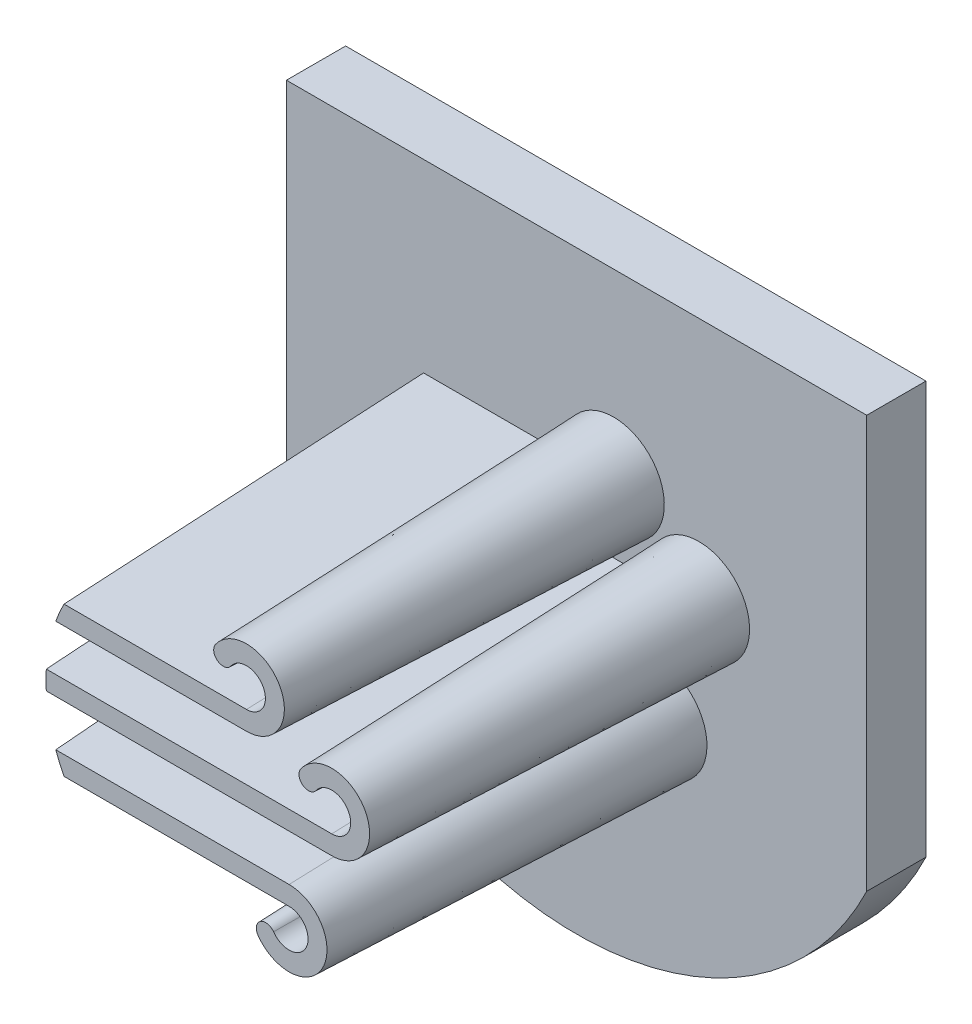
ISO-10303-21;
HEADER;
FILE_DESCRIPTION(('STEP AP214'),'2;1');
FILE_NAME('part.step','',(''),(''),'','','');
FILE_SCHEMA(('AUTOMOTIVE_DESIGN { 1 0 10303 214 1 1 1 1 }'));
ENDSEC;
DATA;
#1=APPLICATION_CONTEXT('core data for automotive mechanical design processes');
#2=APPLICATION_PROTOCOL_DEFINITION('international standard','automotive_design',2000,#1);
#3=PRODUCT_CONTEXT('',#1,'mechanical');
#4=PRODUCT('Part','Part','',(#3));
#5=PRODUCT_RELATED_PRODUCT_CATEGORY('part','',(#4));
#6=PRODUCT_DEFINITION_FORMATION('','',#4);
#7=PRODUCT_DEFINITION_CONTEXT('part definition',#1,'design');
#8=PRODUCT_DEFINITION('design','',#6,#7);
#9=PRODUCT_DEFINITION_SHAPE('','',#8);
#10=(LENGTH_UNIT() NAMED_UNIT(*) SI_UNIT(.MILLI.,.METRE.));
#11=(NAMED_UNIT(*) PLANE_ANGLE_UNIT() SI_UNIT($,.RADIAN.));
#12=(NAMED_UNIT(*) SI_UNIT($,.STERADIAN.) SOLID_ANGLE_UNIT());
#13=UNCERTAINTY_MEASURE_WITH_UNIT(LENGTH_MEASURE(1.E-05),#10,'distance_accuracy_value','');
#14=(GEOMETRIC_REPRESENTATION_CONTEXT(3) GLOBAL_UNCERTAINTY_ASSIGNED_CONTEXT((#13)) GLOBAL_UNIT_ASSIGNED_CONTEXT((#10,
#11,#12)) REPRESENTATION_CONTEXT('',''));
#15=CARTESIAN_POINT('',(0.,0.,0.));
#16=DIRECTION('',(0.,0.,1.));
#17=DIRECTION('',(1.,0.,0.));
#18=AXIS2_PLACEMENT_3D('',#15,#16,#17);
#19=CARTESIAN_POINT('',(1.68118189982806,-1.975,7.74999999998727));
#20=DIRECTION('',(0.,0.,1.));
#21=DIRECTION('',(1.,0.,0.));
#22=AXIS2_PLACEMENT_3D('',#19,#20,#21);
#23=CONICAL_SURFACE('',#22,0.400030477214558,0.0349065850394999);
#24=CARTESIAN_POINT('',(1.68118189982806,-1.975,7.74999999998727));
#25=DIRECTION('',(0.,0.,1.));
#26=DIRECTION('',(1.,0.,0.));
#27=AXIS2_PLACEMENT_3D('',#24,#25,#26);
#28=CIRCLE('',#27,0.400030477214558);
#29=CARTESIAN_POINT('',(1.68118189982806,-1.57496952278529,7.74999999999363));
#30=VERTEX_POINT('',#29);
#31=CARTESIAN_POINT('',(1.35349611664045,-2.20444805555241,7.74999999998727));
#32=VERTEX_POINT('',#31);
#33=EDGE_CURVE('E172',#30,#32,#28,.F.);
#34=ORIENTED_EDGE('',*,*,#33,.F.);
#35=DIRECTION('',(0.,-0.0348994967025009,-0.999390827019096));
#36=VECTOR('',#35,1.);
#37=CARTESIAN_POINT('',(1.68118189982806,-1.57503045864905,7.74825502516488));
#38=LINE('',#37,#36);
#39=CARTESIAN_POINT('',(1.68118189982806,-1.84560548634611,0.));
#40=VERTEX_POINT('',#39);
#41=EDGE_CURVE('E160',#40,#30,#38,.F.);
#42=ORIENTED_EDGE('',*,*,#41,.F.);
#43=CARTESIAN_POINT('',(1.68118189982806,-1.975,0.));
#44=DIRECTION('',(0.,0.,1.));
#45=DIRECTION('',(1.,0.,0.));
#46=AXIS2_PLACEMENT_3D('',#43,#44,#45);
#47=CIRCLE('',#46,0.129394513656959);
#48=CARTESIAN_POINT('',(1.57518811944871,-2.04921764402519,0.));
#49=VERTEX_POINT('',#48);
#50=EDGE_CURVE('E20',#49,#40,#47,.T.);
#51=ORIENTED_EDGE('',*,*,#50,.F.);
#52=DIRECTION('',(-0.0285879940685106,-0.0200175289490657,0.999390827019096));
#53=VECTOR('',#52,1.);
#54=CARTESIAN_POINT('',(14275.679627057,9992.78631169279,-499000.));
#55=LINE('',#54,#53);
#56=EDGE_CURVE('E157',#32,#49,#55,.F.);
#57=ORIENTED_EDGE('',*,*,#56,.F.);
#58=EDGE_LOOP('',(#34,#42,#51,#57));
#59=FACE_BOUND('',#58,.T.);
#60=ADVANCED_FACE('F17',(#59),#23,.F.);
#61=CARTESIAN_POINT('',(1.18969067325467,-2.31914586181063,1.70530256582424E-10));
#62=DIRECTION('',(0.,0.,-1.));
#63=DIRECTION('',(-1.,0.,0.));
#64=AXIS2_PLACEMENT_3D('',#61,#62,#63);
#65=CONICAL_SURFACE('',#64,0.470605486341061,0.0349065850402135);
#66=CARTESIAN_POINT('',(1.18969067325467,-2.31914586181063,0.));
#67=DIRECTION('',(0.,0.,-1.));
#68=DIRECTION('',(-1.,0.,0.));
#69=AXIS2_PLACEMENT_3D('',#66,#67,#68);
#70=CIRCLE('',#69,0.470605486347016);
#71=CARTESIAN_POINT('',(0.804193227060108,-2.58907407959762,0.));
#72=VERTEX_POINT('',#71);
#73=EDGE_CURVE('E165',#49,#72,#70,.F.);
#74=ORIENTED_EDGE('',*,*,#73,.T.);
#75=DIRECTION('',(0.0285879940685106,0.0200175289490656,0.999390827019096));
#76=VECTOR('',#75,1.);
#77=CARTESIAN_POINT('',(-14273.3002457105,-9997.42460341637,-499000.));
#78=LINE('',#77,#76);
#79=CARTESIAN_POINT('',(1.02588522987041,-2.43384366806921,7.74999999998727));
#80=VERTEX_POINT('',#79);
#81=EDGE_CURVE('E214',#80,#72,#78,.F.);
#82=ORIENTED_EDGE('',*,*,#81,.F.);
#83=CARTESIAN_POINT('',(1.18969067325467,-2.31914586181063,7.74999999998727));
#84=DIRECTION('',(0.,0.,-1.));
#85=DIRECTION('',(-1.,0.,0.));
#86=AXIS2_PLACEMENT_3D('',#83,#84,#85);
#87=CIRCLE('',#86,0.199969522783879);
#88=EDGE_CURVE('E174',#32,#80,#87,.F.);
#89=ORIENTED_EDGE('',*,*,#88,.F.);
#90=ORIENTED_EDGE('',*,*,#56,.T.);
#91=EDGE_LOOP('',(#74,#82,#89,#90));
#92=FACE_BOUND('',#91,.T.);
#93=ADVANCED_FACE('F173',(#92),#65,.T.);
#94=CARTESIAN_POINT('',(0.,-0.525,7.75));
#95=DIRECTION('',(0.,0.,1.));
#96=DIRECTION('',(1.,0.,0.));
#97=AXIS2_PLACEMENT_3D('',#94,#95,#96);
#98=PLANE('',#97);
#99=ORIENTED_EDGE('',*,*,#33,.T.);
#100=ORIENTED_EDGE('',*,*,#88,.T.);
#101=CARTESIAN_POINT('',(1.68118189982806,-1.975,7.74999999998727));
#102=DIRECTION('',(0.,0.,-1.));
#103=DIRECTION('',(-1.,0.,0.));
#104=AXIS2_PLACEMENT_3D('',#101,#102,#103);
#105=CIRCLE('',#104,0.799969522784775);
#106=CARTESIAN_POINT('',(1.68118189982806,-1.17503047721471,7.74999999999363));
#107=VERTEX_POINT('',#106);
#108=EDGE_CURVE('E211',#107,#80,#105,.T.);
#109=ORIENTED_EDGE('',*,*,#108,.F.);
#110=DIRECTION('',(1.,0.,0.));
#111=VECTOR('',#110,1.);
#112=CARTESIAN_POINT('',(0.,-1.17503047721494,7.75));
#113=LINE('',#112,#111);
#114=CARTESIAN_POINT('',(-3.243700523438,-1.17503047721494,7.74999999999363));
#115=VERTEX_POINT('',#114);
#116=EDGE_CURVE('E371',#115,#107,#113,.T.);
#117=ORIENTED_EDGE('',*,*,#116,.F.);
#118=CARTESIAN_POINT('',(0.,0.,7.74999999998727));
#119=DIRECTION('',(0.,0.,-1.));
#120=DIRECTION('',(-1.,0.,0.));
#121=AXIS2_PLACEMENT_3D('',#118,#119,#120);
#122=CIRCLE('',#121,3.44996952278214);
#123=CARTESIAN_POINT('',(-3.06948867247192,-1.57496952278529,7.74999999999363));
#124=VERTEX_POINT('',#123);
#125=EDGE_CURVE('E249',#124,#115,#122,.T.);
#126=ORIENTED_EDGE('',*,*,#125,.F.);
#127=DIRECTION('',(1.,0.,0.));
#128=VECTOR('',#127,1.);
#129=CARTESIAN_POINT('',(0.,-1.57496952278506,7.75));
#130=LINE('',#129,#128);
#131=EDGE_CURVE('E257',#30,#124,#130,.F.);
#132=ORIENTED_EDGE('',*,*,#131,.F.);
#133=EDGE_LOOP('',(#99,#100,#109,#117,#126,#132));
#134=FACE_BOUND('',#133,.T.);
#135=ADVANCED_FACE('F255',(#134),#98,.T.);
#136=CARTESIAN_POINT('',(0.,0.,5.6843418860808E-11));
#137=DIRECTION('',(0.,0.,-1.));
#138=DIRECTION('',(-1.,0.,0.));
#139=AXIS2_PLACEMENT_3D('',#136,#137,#138);
#140=CONICAL_SURFACE('',#139,3.72060548634329,0.0349065850402135);
#141=CARTESIAN_POINT('',(0.,0.,0.));
#142=DIRECTION('',(0.,0.,-1.));
#143=DIRECTION('',(-1.,0.,0.));
#144=AXIS2_PLACEMENT_3D('',#141,#142,#143);
#145=CIRCLE('',#144,3.72060548634528);
#146=CARTESIAN_POINT('',(-3.60901312670119,-0.904394513653894,0.));
#147=VERTEX_POINT('',#146);
#148=CARTESIAN_POINT('',(-3.23057975815411,-1.84560548634611,0.));
#149=VERTEX_POINT('',#148);
#150=EDGE_CURVE('E247',#147,#149,#145,.F.);
#151=ORIENTED_EDGE('',*,*,#150,.T.);
#152=CARTESIAN_POINT('',(-3.06948867247364,-1.57496952278506,7.75));
#153=CARTESIAN_POINT('',(-3.1500342153141,-1.70682745951414,3.97408272646348));
#154=CARTESIAN_POINT('',(-3.23057975815455,-1.84560548634611,0.));
#155=B_SPLINE_CURVE_WITH_KNOTS('',2,(#152,#153,#154),.UNSPECIFIED.,.F.,.F.,(3,3),(0.,1.),.UNSPECIFIED.);
#156=EDGE_CURVE('E215',#124,#149,#155,.T.);
#157=ORIENTED_EDGE('',*,*,#156,.F.);
#158=ORIENTED_EDGE('',*,*,#125,.T.);
#159=CARTESIAN_POINT('',(-3.60901312670198,-0.904394513653891,0.));
#160=CARTESIAN_POINT('',(-3.42635682506583,-1.04692618722687,4.08157310527367));
#161=CARTESIAN_POINT('',(-3.24370052343952,-1.17503047721494,7.75));
#162=B_SPLINE_CURVE_WITH_KNOTS('',2,(#159,#160,#161),.UNSPECIFIED.,.F.,.F.,(3,3),(0.,1.),.UNSPECIFIED.);
#163=EDGE_CURVE('E366',#147,#115,#162,.T.);
#164=ORIENTED_EDGE('',*,*,#163,.F.);
#165=EDGE_LOOP('',(#151,#157,#158,#164));
#166=FACE_BOUND('',#165,.T.);
#167=ADVANCED_FACE('F415',(#166),#140,.T.);
#168=CARTESIAN_POINT('',(2.08969067325467,0.944145861810627,1.70530256582424E-10));
#169=DIRECTION('',(0.,0.,-1.));
#170=DIRECTION('',(-1.,0.,0.));
#171=AXIS2_PLACEMENT_3D('',#168,#169,#170);
#172=CONICAL_SURFACE('',#171,0.470605486338964,0.0349065850397557);
#173=CARTESIAN_POINT('',(2.08969067325467,0.944145861810627,0.));
#174=DIRECTION('',(0.,0.,-1.));
#175=DIRECTION('',(-1.,0.,0.));
#176=AXIS2_PLACEMENT_3D('',#173,#174,#175);
#177=CIRCLE('',#176,0.470605486344919);
#178=CARTESIAN_POINT('',(1.70419322706021,1.21407407959724,0.));
#179=VERTEX_POINT('',#178);
#180=CARTESIAN_POINT('',(2.47518811944563,0.674217644027312,0.));
#181=VERTEX_POINT('',#180);
#182=EDGE_CURVE('E244',#179,#181,#177,.F.);
#183=ORIENTED_EDGE('',*,*,#182,.T.);
#184=DIRECTION('',(0.0285879940685106,-0.0200175289490656,-0.999390827019096));
#185=VECTOR('',#184,1.);
#186=CARTESIAN_POINT('',(-14271.6292508181,9995.50974698082,499000.));
#187=LINE('',#186,#185);
#188=CARTESIAN_POINT('',(2.25349611663888,0.829448055554044,7.74999999998727));
#189=VERTEX_POINT('',#188);
#190=EDGE_CURVE('E179',#181,#189,#187,.F.);
#191=ORIENTED_EDGE('',*,*,#190,.T.);
#192=CARTESIAN_POINT('',(2.08969067325467,0.944145861810627,7.74999999998727));
#193=DIRECTION('',(0.,0.,-1.));
#194=DIRECTION('',(-1.,0.,0.));
#195=AXIS2_PLACEMENT_3D('',#192,#193,#194);
#196=CIRCLE('',#195,0.199969522785334);
#197=CARTESIAN_POINT('',(1.9258852298685,1.05884366806912,7.74999999998727));
#198=VERTEX_POINT('',#197);
#199=EDGE_CURVE('E241',#198,#189,#196,.F.);
#200=ORIENTED_EDGE('',*,*,#199,.F.);
#201=DIRECTION('',(0.0285879940685105,-0.0200175289490657,0.999390827019096));
#202=VECTOR('',#201,1.);
#203=CARTESIAN_POINT('',(-14272.4002457105,9996.04960341643,-499000.));
#204=LINE('',#203,#202);
#205=EDGE_CURVE('E337',#179,#198,#204,.T.);
#206=ORIENTED_EDGE('',*,*,#205,.F.);
#207=EDGE_LOOP('',(#183,#191,#200,#206));
#208=FACE_BOUND('',#207,.T.);
#209=ADVANCED_FACE('F411',(#208),#172,.T.);
#210=CARTESIAN_POINT('',(0.,-0.525,7.75));
#211=DIRECTION('',(0.,0.,1.));
#212=DIRECTION('',(1.,0.,0.));
#213=AXIS2_PLACEMENT_3D('',#210,#211,#212);
#214=PLANE('',#213);
#215=CARTESIAN_POINT('',(2.58118189982806,0.6,7.74999999998727));
#216=DIRECTION('',(0.,0.,-1.));
#217=DIRECTION('',(-1.,0.,0.));
#218=AXIS2_PLACEMENT_3D('',#215,#216,#217);
#219=CIRCLE('',#218,0.79996952278623);
#220=CARTESIAN_POINT('',(2.58118189982806,-0.199969522786761,7.75000000000466));
#221=VERTEX_POINT('',#220);
#222=EDGE_CURVE('E206',#198,#221,#219,.T.);
#223=ORIENTED_EDGE('',*,*,#222,.F.);
#224=ORIENTED_EDGE('',*,*,#199,.T.);
#225=CARTESIAN_POINT('',(2.58118189982806,0.6,7.74999999998727));
#226=DIRECTION('',(0.,0.,1.));
#227=DIRECTION('',(1.,0.,0.));
#228=AXIS2_PLACEMENT_3D('',#225,#226,#227);
#229=CIRCLE('',#228,0.400030477216014);
#230=CARTESIAN_POINT('',(2.58118189982806,0.199969522785281,7.74999999999363));
#231=VERTEX_POINT('',#230);
#232=EDGE_CURVE('E237',#189,#231,#229,.F.);
#233=ORIENTED_EDGE('',*,*,#232,.T.);
#234=DIRECTION('',(1.,0.,0.));
#235=VECTOR('',#234,1.);
#236=CARTESIAN_POINT('',(0.,0.199969522785059,7.75));
#237=LINE('',#236,#235);
#238=CARTESIAN_POINT('',(-3.44416926095464,0.199969522785282,7.74999999999363));
#239=VERTEX_POINT('',#238);
#240=EDGE_CURVE('E329',#239,#231,#237,.T.);
#241=ORIENTED_EDGE('',*,*,#240,.F.);
#242=CARTESIAN_POINT('',(0.,0.,7.74999999998727));
#243=DIRECTION('',(0.,0.,-1.));
#244=DIRECTION('',(-1.,0.,0.));
#245=AXIS2_PLACEMENT_3D('',#242,#243,#244);
#246=CIRCLE('',#245,3.44996952278564);
#247=CARTESIAN_POINT('',(-3.44416926095464,-0.199969522785281,7.74999999999363));
#248=VERTEX_POINT('',#247);
#249=EDGE_CURVE('E234',#248,#239,#246,.T.);
#250=ORIENTED_EDGE('',*,*,#249,.F.);
#251=DIRECTION('',(1.,0.,0.));
#252=VECTOR('',#251,1.);
#253=CARTESIAN_POINT('',(0.,-0.199969522785059,7.75));
#254=LINE('',#253,#252);
#255=EDGE_CURVE('E347',#221,#248,#254,.F.);
#256=ORIENTED_EDGE('',*,*,#255,.F.);
#257=EDGE_LOOP('',(#223,#224,#233,#241,#250,#256));
#258=FACE_BOUND('',#257,.T.);
#259=ADVANCED_FACE('F407',(#258),#214,.T.);
#260=CARTESIAN_POINT('',(2.58118189982806,0.6,7.74999999998727));
#261=DIRECTION('',(0.,0.,1.));
#262=DIRECTION('',(1.,0.,0.));
#263=AXIS2_PLACEMENT_3D('',#260,#261,#262);
#264=CONICAL_SURFACE('',#263,0.400030477216014,0.0349065850394999);
#265=ORIENTED_EDGE('',*,*,#232,.F.);
#266=ORIENTED_EDGE('',*,*,#190,.F.);
#267=CARTESIAN_POINT('',(2.58118189982806,0.6,0.));
#268=DIRECTION('',(0.,0.,1.));
#269=DIRECTION('',(1.,0.,0.));
#270=AXIS2_PLACEMENT_3D('',#267,#268,#269);
#271=CIRCLE('',#270,0.129394513658414);
#272=CARTESIAN_POINT('',(2.58118189982806,0.470605486346103,0.));
#273=VERTEX_POINT('',#272);
#274=EDGE_CURVE('E239',#273,#181,#271,.T.);
#275=ORIENTED_EDGE('',*,*,#274,.F.);
#276=DIRECTION('',(0.,-0.0348994967025009,0.999390827019096));
#277=VECTOR('',#276,1.);
#278=CARTESIAN_POINT('',(2.58118189982806,0.200030458649045,7.74825502516488));
#279=LINE('',#278,#277);
#280=EDGE_CURVE('E328',#231,#273,#279,.F.);
#281=ORIENTED_EDGE('',*,*,#280,.F.);
#282=EDGE_LOOP('',(#265,#266,#275,#281));
#283=FACE_BOUND('',#282,.T.);
#284=ADVANCED_FACE('F403',(#283),#264,.F.);
#285=CARTESIAN_POINT('',(0.,0.,5.6843418860808E-11));
#286=DIRECTION('',(0.,0.,-1.));
#287=DIRECTION('',(-1.,0.,0.));
#288=AXIS2_PLACEMENT_3D('',#285,#286,#287);
#289=CONICAL_SURFACE('',#288,3.7206054863468,0.0349065850402135);
#290=CARTESIAN_POINT('',(0.,0.,0.));
#291=DIRECTION('',(0.,0.,-1.));
#292=DIRECTION('',(-1.,0.,0.));
#293=AXIS2_PLACEMENT_3D('',#290,#291,#292);
#294=CIRCLE('',#293,3.72060548634878);
#295=CARTESIAN_POINT('',(-3.69072291851606,0.470605486346103,0.));
#296=VERTEX_POINT('',#295);
#297=CARTESIAN_POINT('',(-3.69072291851642,-0.470605486346589,0.));
#298=VERTEX_POINT('',#297);
#299=EDGE_CURVE('E232',#296,#298,#294,.F.);
#300=ORIENTED_EDGE('',*,*,#299,.T.);
#301=CARTESIAN_POINT('',(-3.44416926095436,-0.199969522785058,7.75));
#302=CARTESIAN_POINT('',(-3.56744608972748,-0.330611450246071,4.00890467585814));
#303=CARTESIAN_POINT('',(-3.69072291851555,-0.470605486346104,0.));
#304=B_SPLINE_CURVE_WITH_KNOTS('',2,(#301,#302,#303),.UNSPECIFIED.,.F.,.F.,(3,3),(0.,1.),.UNSPECIFIED.);
#305=EDGE_CURVE('E210',#248,#298,#304,.T.);
#306=ORIENTED_EDGE('',*,*,#305,.F.);
#307=ORIENTED_EDGE('',*,*,#249,.T.);
#308=CARTESIAN_POINT('',(-3.6907229185147,0.470605486346104,0.));
#309=CARTESIAN_POINT('',(-3.56744608973465,0.330611450253676,4.0089046756404));
#310=CARTESIAN_POINT('',(-3.44416926095435,0.199969522785059,7.75));
#311=B_SPLINE_CURVE_WITH_KNOTS('',2,(#308,#309,#310),.UNSPECIFIED.,.F.,.F.,(3,3),(0.,1.),.UNSPECIFIED.);
#312=EDGE_CURVE('E324',#296,#239,#311,.T.);
#313=ORIENTED_EDGE('',*,*,#312,.F.);
#314=EDGE_LOOP('',(#300,#306,#307,#313));
#315=FACE_BOUND('',#314,.T.);
#316=ADVANCED_FACE('F400',(#315),#289,.T.);
#317=CARTESIAN_POINT('',(0.289690673254666,2.31914586181063,1.70530256582424E-10));
#318=DIRECTION('',(0.,0.,-1.));
#319=DIRECTION('',(-1.,0.,0.));
#320=AXIS2_PLACEMENT_3D('',#317,#318,#319);
#321=CONICAL_SURFACE('',#320,0.470605486336057,0.0349065850402135);
#322=CARTESIAN_POINT('',(0.289690673254666,2.31914586181063,0.));
#323=DIRECTION('',(0.,0.,-1.));
#324=DIRECTION('',(-1.,0.,0.));
#325=AXIS2_PLACEMENT_3D('',#322,#323,#324);
#326=CIRCLE('',#325,0.470605486342012);
#327=CARTESIAN_POINT('',(-0.0958067729372949,2.58907407959514,0.));
#328=VERTEX_POINT('',#327);
#329=CARTESIAN_POINT('',(0.675188119444742,2.0492176440282,0.));
#330=VERTEX_POINT('',#329);
#331=EDGE_CURVE('E229',#328,#330,#326,.F.);
#332=ORIENTED_EDGE('',*,*,#331,.T.);
#333=DIRECTION('',(0.0285879940685104,-0.0200175289490659,-0.999390827019096));
#334=VECTOR('',#333,1.);
#335=CARTESIAN_POINT('',(-14273.429250818,9996.88474698098,499000.));
#336=LINE('',#335,#334);
#337=CARTESIAN_POINT('',(0.453496116636133,2.20444805555445,7.74999999998727));
#338=VERTEX_POINT('',#337);
#339=EDGE_CURVE('E223',#330,#338,#336,.F.);
#340=ORIENTED_EDGE('',*,*,#339,.T.);
#341=CARTESIAN_POINT('',(0.289690673254666,2.31914586181063,7.74999999998727));
#342=DIRECTION('',(0.,0.,-1.));
#343=DIRECTION('',(-1.,0.,0.));
#344=AXIS2_PLACEMENT_3D('',#341,#342,#343);
#345=CIRCLE('',#344,0.199969522778875);
#346=CARTESIAN_POINT('',(0.125885229872456,2.43384366806688,7.74999999998727));
#347=VERTEX_POINT('',#346);
#348=EDGE_CURVE('E226',#347,#338,#345,.F.);
#349=ORIENTED_EDGE('',*,*,#348,.F.);
#350=DIRECTION('',(0.0285879940685106,-0.0200175289490656,0.999390827019096));
#351=VECTOR('',#350,1.);
#352=CARTESIAN_POINT('',(-14274.2002457105,9997.42460341641,-499000.));
#353=LINE('',#352,#351);
#354=EDGE_CURVE('E289',#328,#347,#353,.T.);
#355=ORIENTED_EDGE('',*,*,#354,.F.);
#356=EDGE_LOOP('',(#332,#340,#349,#355));
#357=FACE_BOUND('',#356,.T.);
#358=ADVANCED_FACE('F267',(#357),#321,.T.);
#359=CARTESIAN_POINT('',(0.,-0.525,7.75));
#360=DIRECTION('',(0.,0.,1.));
#361=DIRECTION('',(1.,0.,0.));
#362=AXIS2_PLACEMENT_3D('',#359,#360,#361);
#363=PLANE('',#362);
#364=CARTESIAN_POINT('',(0.781181899828061,1.975,7.74999999998727));
#365=DIRECTION('',(0.,0.,-1.));
#366=DIRECTION('',(-1.,0.,0.));
#367=AXIS2_PLACEMENT_3D('',#364,#365,#366);
#368=CIRCLE('',#367,0.799969522783319);
#369=CARTESIAN_POINT('',(0.781181899828061,1.17503047721399,7.75000000000466));
#370=VERTEX_POINT('',#369);
#371=EDGE_CURVE('E201',#347,#370,#368,.T.);
#372=ORIENTED_EDGE('',*,*,#371,.F.);
#373=ORIENTED_EDGE('',*,*,#348,.T.);
#374=CARTESIAN_POINT('',(0.781181899828061,1.975,7.74999999998727));
#375=DIRECTION('',(0.,0.,1.));
#376=DIRECTION('',(1.,0.,0.));
#377=AXIS2_PLACEMENT_3D('',#374,#375,#376);
#378=CIRCLE('',#377,0.400030477216655);
#379=CARTESIAN_POINT('',(0.781181899828062,1.57496952278529,7.74999999999363));
#380=VERTEX_POINT('',#379);
#381=EDGE_CURVE('E221',#338,#380,#378,.F.);
#382=ORIENTED_EDGE('',*,*,#381,.T.);
#383=DIRECTION('',(1.,0.,0.));
#384=VECTOR('',#383,1.);
#385=CARTESIAN_POINT('',(0.,1.57496952278506,7.75));
#386=LINE('',#385,#384);
#387=CARTESIAN_POINT('',(-3.06948867247398,1.57496952278506,7.74999999999363));
#388=VERTEX_POINT('',#387);
#389=EDGE_CURVE('E284',#388,#380,#386,.T.);
#390=ORIENTED_EDGE('',*,*,#389,.F.);
#391=CARTESIAN_POINT('',(0.,0.,7.74999999998727));
#392=DIRECTION('',(0.,0.,-1.));
#393=DIRECTION('',(-1.,0.,0.));
#394=AXIS2_PLACEMENT_3D('',#391,#392,#393);
#395=CIRCLE('',#394,3.44996952278565);
#396=CARTESIAN_POINT('',(-3.24370052343993,1.17503047721471,7.74999999999363));
#397=VERTEX_POINT('',#396);
#398=EDGE_CURVE('E218',#397,#388,#395,.T.);
#399=ORIENTED_EDGE('',*,*,#398,.F.);
#400=DIRECTION('',(1.,0.,0.));
#401=VECTOR('',#400,1.);
#402=CARTESIAN_POINT('',(0.,1.17503047721494,7.75));
#403=LINE('',#402,#401);
#404=EDGE_CURVE('E303',#370,#397,#403,.F.);
#405=ORIENTED_EDGE('',*,*,#404,.F.);
#406=EDGE_LOOP('',(#372,#373,#382,#390,#399,#405));
#407=FACE_BOUND('',#406,.T.);
#408=ADVANCED_FACE('F273',(#407),#363,.T.);
#409=CARTESIAN_POINT('',(0.781181899828061,1.975,7.74999999998727));
#410=DIRECTION('',(0.,0.,1.));
#411=DIRECTION('',(1.,0.,0.));
#412=AXIS2_PLACEMENT_3D('',#409,#410,#411);
#413=CONICAL_SURFACE('',#412,0.400030477216655,0.0349065850394999);
#414=ORIENTED_EDGE('',*,*,#381,.F.);
#415=ORIENTED_EDGE('',*,*,#339,.F.);
#416=CARTESIAN_POINT('',(0.781181899828061,1.975,0.));
#417=DIRECTION('',(0.,0.,1.));
#418=DIRECTION('',(1.,0.,0.));
#419=AXIS2_PLACEMENT_3D('',#416,#417,#418);
#420=CIRCLE('',#419,0.129394513659055);
#421=CARTESIAN_POINT('',(0.781181899828062,1.84560548634611,0.));
#422=VERTEX_POINT('',#421);
#423=EDGE_CURVE('E224',#422,#330,#420,.T.);
#424=ORIENTED_EDGE('',*,*,#423,.F.);
#425=DIRECTION('',(0.,-0.0348994967025009,0.999390827019096));
#426=VECTOR('',#425,1.);
#427=CARTESIAN_POINT('',(0.781181899828062,1.57503045864905,7.74825502516488));
#428=LINE('',#427,#426);
#429=EDGE_CURVE('E278',#380,#422,#428,.F.);
#430=ORIENTED_EDGE('',*,*,#429,.F.);
#431=EDGE_LOOP('',(#414,#415,#424,#430));
#432=FACE_BOUND('',#431,.T.);
#433=ADVANCED_FACE('F276',(#432),#413,.F.);
#434=CARTESIAN_POINT('',(0.,0.,5.6843418860808E-11));
#435=DIRECTION('',(0.,0.,-1.));
#436=DIRECTION('',(-1.,0.,0.));
#437=AXIS2_PLACEMENT_3D('',#434,#435,#436);
#438=CONICAL_SURFACE('',#437,3.72060548634681,0.0349065850402135);
#439=CARTESIAN_POINT('',(0.,0.,0.));
#440=DIRECTION('',(0.,0.,-1.));
#441=DIRECTION('',(-1.,0.,0.));
#442=AXIS2_PLACEMENT_3D('',#439,#440,#441);
#443=CIRCLE('',#442,3.72060548634879);
#444=CARTESIAN_POINT('',(-3.23057975815611,1.84560548634611,0.));
#445=VERTEX_POINT('',#444);
#446=CARTESIAN_POINT('',(-3.60901312670306,0.904394513653584,0.));
#447=VERTEX_POINT('',#446);
#448=EDGE_CURVE('E216',#445,#447,#443,.F.);
#449=ORIENTED_EDGE('',*,*,#448,.T.);
#450=CARTESIAN_POINT('',(-3.24370052343952,1.17503047721494,7.75));
#451=CARTESIAN_POINT('',(-3.42635682506583,1.04692618722687,4.08157310527355));
#452=CARTESIAN_POINT('',(-3.60901312670198,0.904394513653892,0.));
#453=B_SPLINE_CURVE_WITH_KNOTS('',2,(#450,#451,#452),.UNSPECIFIED.,.F.,.F.,(3,3),(0.,1.),.UNSPECIFIED.);
#454=EDGE_CURVE('E205',#397,#447,#453,.T.);
#455=ORIENTED_EDGE('',*,*,#454,.F.);
#456=ORIENTED_EDGE('',*,*,#398,.T.);
#457=CARTESIAN_POINT('',(-3.23057975815455,1.84560548634611,0.));
#458=CARTESIAN_POINT('',(-3.15003421531429,1.70682745951447,3.9740827264541));
#459=CARTESIAN_POINT('',(-3.06948867247363,1.57496952278506,7.75));
#460=B_SPLINE_CURVE_WITH_KNOTS('',2,(#457,#458,#459),.UNSPECIFIED.,.F.,.F.,(3,3),(0.,1.),.UNSPECIFIED.);
#461=EDGE_CURVE('E283',#445,#388,#460,.T.);
#462=ORIENTED_EDGE('',*,*,#461,.F.);
#463=EDGE_LOOP('',(#449,#455,#456,#462));
#464=FACE_BOUND('',#463,.T.);
#465=ADVANCED_FACE('F390',(#464),#438,.T.);
#466=CARTESIAN_POINT('',(0.,-1.57503045864905,7.74825502516488));
#467=DIRECTION('',(0.,-0.999390827019096,0.0348994967025009));
#468=DIRECTION('',(0.,-0.0348994967025009,-0.999390827019096));
#469=AXIS2_PLACEMENT_3D('',#466,#467,#468);
#470=PLANE('',#469);
#471=ORIENTED_EDGE('',*,*,#156,.T.);
#472=DIRECTION('',(-1.,0.,0.));
#473=VECTOR('',#472,1.);
#474=CARTESIAN_POINT('',(0.,-1.84560548634611,0.));
#475=LINE('',#474,#473);
#476=EDGE_CURVE('E200',#149,#40,#475,.F.);
#477=ORIENTED_EDGE('',*,*,#476,.T.);
#478=ORIENTED_EDGE('',*,*,#41,.T.);
#479=ORIENTED_EDGE('',*,*,#131,.T.);
#480=EDGE_LOOP('',(#471,#477,#478,#479));
#481=FACE_BOUND('',#480,.T.);
#482=ADVANCED_FACE('F262',(#481),#470,.T.);
#483=CARTESIAN_POINT('',(1.68118189982806,-1.975,5.6843418860808E-11));
#484=DIRECTION('',(0.,0.,-1.));
#485=DIRECTION('',(-1.,0.,0.));
#486=AXIS2_PLACEMENT_3D('',#483,#484,#485);
#487=CONICAL_SURFACE('',#486,1.07060548634593,0.0349065850402135);
#488=CARTESIAN_POINT('',(1.68118189982806,-1.975,0.));
#489=DIRECTION('',(0.,0.,-1.));
#490=DIRECTION('',(-1.,0.,0.));
#491=AXIS2_PLACEMENT_3D('',#488,#489,#490);
#492=CIRCLE('',#491,1.07060548634791);
#493=CARTESIAN_POINT('',(1.68118189982806,-0.904394513653895,0.));
#494=VERTEX_POINT('',#493);
#495=EDGE_CURVE('E168',#72,#494,#492,.F.);
#496=ORIENTED_EDGE('',*,*,#495,.T.);
#497=DIRECTION('',(0.,-0.0348994967025009,0.999390827019096));
#498=VECTOR('',#497,1.);
#499=CARTESIAN_POINT('',(1.68118189982806,-1.17496954135095,7.74825502516488));
#500=LINE('',#499,#498);
#501=EDGE_CURVE('E370',#107,#494,#500,.F.);
#502=ORIENTED_EDGE('',*,*,#501,.F.);
#503=ORIENTED_EDGE('',*,*,#108,.T.);
#504=ORIENTED_EDGE('',*,*,#81,.T.);
#505=EDGE_LOOP('',(#496,#502,#503,#504));
#506=FACE_BOUND('',#505,.T.);
#507=ADVANCED_FACE('F363',(#506),#487,.T.);
#508=CARTESIAN_POINT('',(0.,-1.17496954135095,7.74825502516488));
#509=DIRECTION('',(0.,0.999390827019096,0.0348994967025009));
#510=DIRECTION('',(0.,-0.0348994967025009,0.999390827019096));
#511=AXIS2_PLACEMENT_3D('',#508,#509,#510);
#512=PLANE('',#511);
#513=DIRECTION('',(-1.,0.,0.));
#514=VECTOR('',#513,1.);
#515=CARTESIAN_POINT('',(0.,-0.904394513653897,0.));
#516=LINE('',#515,#514);
#517=EDGE_CURVE('E199',#494,#147,#516,.T.);
#518=ORIENTED_EDGE('',*,*,#517,.T.);
#519=ORIENTED_EDGE('',*,*,#163,.T.);
#520=ORIENTED_EDGE('',*,*,#116,.T.);
#521=ORIENTED_EDGE('',*,*,#501,.T.);
#522=EDGE_LOOP('',(#518,#519,#520,#521));
#523=FACE_BOUND('',#522,.T.);
#524=ADVANCED_FACE('F358',(#523),#512,.T.);
#525=CARTESIAN_POINT('',(0.,-0.200030458649045,7.74825502516488));
#526=DIRECTION('',(0.,-0.999390827019096,0.0348994967025009));
#527=DIRECTION('',(0.,-0.0348994967025009,-0.999390827019096));
#528=AXIS2_PLACEMENT_3D('',#525,#526,#527);
#529=PLANE('',#528);
#530=ORIENTED_EDGE('',*,*,#305,.T.);
#531=DIRECTION('',(-1.,0.,0.));
#532=VECTOR('',#531,1.);
#533=CARTESIAN_POINT('',(0.,-0.470605486347075,0.));
#534=LINE('',#533,#532);
#535=CARTESIAN_POINT('',(2.58118189982806,-0.470605486347564,1.4210854715202E-11));
#536=VERTEX_POINT('',#535);
#537=EDGE_CURVE('E197',#298,#536,#534,.F.);
#538=ORIENTED_EDGE('',*,*,#537,.T.);
#539=DIRECTION('',(0.,0.034899496702501,0.999390827019096));
#540=VECTOR('',#539,1.);
#541=CARTESIAN_POINT('',(2.58118189982913,-17425.9345818685,-499000.));
#542=LINE('',#541,#540);
#543=EDGE_CURVE('E209',#221,#536,#542,.F.);
#544=ORIENTED_EDGE('',*,*,#543,.F.);
#545=ORIENTED_EDGE('',*,*,#255,.T.);
#546=EDGE_LOOP('',(#530,#538,#544,#545));
#547=FACE_BOUND('',#546,.T.);
#548=ADVANCED_FACE('F349',(#547),#529,.T.);
#549=CARTESIAN_POINT('',(2.58118189982806,0.6,5.6843418860808E-11));
#550=DIRECTION('',(0.,0.,-1.));
#551=DIRECTION('',(-1.,0.,0.));
#552=AXIS2_PLACEMENT_3D('',#549,#550,#551);
#553=CONICAL_SURFACE('',#552,1.07060548634738,0.0349065850402135);
#554=CARTESIAN_POINT('',(2.58118189982806,0.6,0.));
#555=DIRECTION('',(0.,0.,-1.));
#556=DIRECTION('',(-1.,0.,0.));
#557=AXIS2_PLACEMENT_3D('',#554,#555,#556);
#558=CIRCLE('',#557,1.07060548634937);
#559=EDGE_CURVE('E193',#536,#179,#558,.F.);
#560=ORIENTED_EDGE('',*,*,#559,.T.);
#561=ORIENTED_EDGE('',*,*,#205,.T.);
#562=ORIENTED_EDGE('',*,*,#222,.T.);
#563=ORIENTED_EDGE('',*,*,#543,.T.);
#564=EDGE_LOOP('',(#560,#561,#562,#563));
#565=FACE_BOUND('',#564,.T.);
#566=ADVANCED_FACE('F321',(#565),#553,.T.);
#567=CARTESIAN_POINT('',(0.,0.200030458649045,7.74825502516488));
#568=DIRECTION('',(0.,0.999390827019096,0.0348994967025009));
#569=DIRECTION('',(0.,-0.0348994967025009,0.999390827019096));
#570=AXIS2_PLACEMENT_3D('',#567,#568,#569);
#571=PLANE('',#570);
#572=DIRECTION('',(-1.,0.,0.));
#573=VECTOR('',#572,1.);
#574=CARTESIAN_POINT('',(0.,0.470605486346103,0.));
#575=LINE('',#574,#573);
#576=EDGE_CURVE('E196',#273,#296,#575,.T.);
#577=ORIENTED_EDGE('',*,*,#576,.T.);
#578=ORIENTED_EDGE('',*,*,#312,.T.);
#579=ORIENTED_EDGE('',*,*,#240,.T.);
#580=ORIENTED_EDGE('',*,*,#280,.T.);
#581=EDGE_LOOP('',(#577,#578,#579,#580));
#582=FACE_BOUND('',#581,.T.);
#583=ADVANCED_FACE('F316',(#582),#571,.T.);
#584=CARTESIAN_POINT('',(0.,1.17496954135095,7.74825502516488));
#585=DIRECTION('',(0.,-0.999390827019096,0.0348994967025009));
#586=DIRECTION('',(0.,-0.0348994967025009,-0.999390827019096));
#587=AXIS2_PLACEMENT_3D('',#584,#585,#586);
#588=PLANE('',#587);
#589=ORIENTED_EDGE('',*,*,#454,.T.);
#590=DIRECTION('',(-1.,0.,0.));
#591=VECTOR('',#590,1.);
#592=CARTESIAN_POINT('',(0.,0.904394513653276,0.));
#593=LINE('',#592,#591);
#594=CARTESIAN_POINT('',(0.781181899828061,0.904394513652999,1.4210854715202E-11));
#595=VERTEX_POINT('',#594);
#596=EDGE_CURVE('E192',#447,#595,#593,.F.);
#597=ORIENTED_EDGE('',*,*,#596,.T.);
#598=DIRECTION('',(0.,0.034899496702501,0.999390827019096));
#599=VECTOR('',#598,1.);
#600=CARTESIAN_POINT('',(0.781181899829128,-17424.5595818685,-499000.));
#601=LINE('',#600,#599);
#602=EDGE_CURVE('E204',#370,#595,#601,.F.);
#603=ORIENTED_EDGE('',*,*,#602,.F.);
#604=ORIENTED_EDGE('',*,*,#404,.T.);
#605=EDGE_LOOP('',(#589,#597,#603,#604));
#606=FACE_BOUND('',#605,.T.);
#607=ADVANCED_FACE('F305',(#606),#588,.T.);
#608=CARTESIAN_POINT('',(0.781181899828061,1.975,5.6843418860808E-11));
#609=DIRECTION('',(0.,0.,-1.));
#610=DIRECTION('',(-1.,0.,0.));
#611=AXIS2_PLACEMENT_3D('',#608,#609,#610);
#612=CONICAL_SURFACE('',#611,1.07060548634447,0.0349065850402135);
#613=CARTESIAN_POINT('',(0.781181899828061,1.975,0.));
#614=DIRECTION('',(0.,0.,-1.));
#615=DIRECTION('',(-1.,0.,0.));
#616=AXIS2_PLACEMENT_3D('',#613,#614,#615);
#617=CIRCLE('',#616,1.07060548634646);
#618=EDGE_CURVE('E188',#595,#328,#617,.F.);
#619=ORIENTED_EDGE('',*,*,#618,.T.);
#620=ORIENTED_EDGE('',*,*,#354,.T.);
#621=ORIENTED_EDGE('',*,*,#371,.T.);
#622=ORIENTED_EDGE('',*,*,#602,.T.);
#623=EDGE_LOOP('',(#619,#620,#621,#622));
#624=FACE_BOUND('',#623,.T.);
#625=ADVANCED_FACE('F315',(#624),#612,.T.);
#626=CARTESIAN_POINT('',(0.,1.57503045864905,7.74825502516488));
#627=DIRECTION('',(0.,0.999390827019096,0.0348994967025009));
#628=DIRECTION('',(0.,-0.0348994967025009,0.999390827019096));
#629=AXIS2_PLACEMENT_3D('',#626,#627,#628);
#630=PLANE('',#629);
#631=DIRECTION('',(-1.,0.,0.));
#632=VECTOR('',#631,1.);
#633=CARTESIAN_POINT('',(0.,1.84560548634611,0.));
#634=LINE('',#633,#632);
#635=EDGE_CURVE('E191',#422,#445,#634,.T.);
#636=ORIENTED_EDGE('',*,*,#635,.T.);
#637=ORIENTED_EDGE('',*,*,#461,.T.);
#638=ORIENTED_EDGE('',*,*,#389,.T.);
#639=ORIENTED_EDGE('',*,*,#429,.T.);
#640=EDGE_LOOP('',(#636,#637,#638,#639));
#641=FACE_BOUND('',#640,.T.);
#642=ADVANCED_FACE('F287',(#641),#630,.T.);
#643=CARTESIAN_POINT('',(0.,0.,0.));
#644=DIRECTION('',(0.,0.,-1.));
#645=DIRECTION('',(-1.,0.,0.));
#646=AXIS2_PLACEMENT_3D('',#643,#644,#645);
#647=PLANE('',#646);
#648=DIRECTION('',(0.,1.,0.));
#649=VECTOR('',#648,1.);
#650=CARTESIAN_POINT('',(-6.125,1.39814734993636,0.));
#651=LINE('',#650,#649);
#652=CARTESIAN_POINT('',(-6.125,5.75,0.));
#653=VERTEX_POINT('',#652);
#654=CARTESIAN_POINT('',(-6.125,-2.95370530012729,0.));
#655=VERTEX_POINT('',#654);
#656=EDGE_CURVE('E479',#653,#655,#651,.F.);
#657=ORIENTED_EDGE('',*,*,#656,.T.);
#658=CARTESIAN_POINT('',(0.,0.,0.));
#659=DIRECTION('',(0.,0.,1.));
#660=DIRECTION('',(1.,0.,0.));
#661=AXIS2_PLACEMENT_3D('',#658,#659,#660);
#662=CIRCLE('',#661,6.8);
#663=CARTESIAN_POINT('',(6.125,-2.95370530012728,0.));
#664=VERTEX_POINT('',#663);
#665=EDGE_CURVE('E184',#664,#655,#662,.F.);
#666=ORIENTED_EDGE('',*,*,#665,.F.);
#667=DIRECTION('',(0.,-1.,0.));
#668=VECTOR('',#667,1.);
#669=CARTESIAN_POINT('',(6.125,1.39814734993636,0.));
#670=LINE('',#669,#668);
#671=CARTESIAN_POINT('',(6.125,5.75,0.));
#672=VERTEX_POINT('',#671);
#673=EDGE_CURVE('E187',#664,#672,#670,.F.);
#674=ORIENTED_EDGE('',*,*,#673,.T.);
#675=DIRECTION('',(1.,0.,0.));
#676=VECTOR('',#675,1.);
#677=CARTESIAN_POINT('',(0.,5.75,0.));
#678=LINE('',#677,#676);
#679=EDGE_CURVE('E463',#672,#653,#678,.F.);
#680=ORIENTED_EDGE('',*,*,#679,.T.);
#681=EDGE_LOOP('',(#657,#666,#674,#680));
#682=FACE_BOUND('',#681,.T.);
#683=ORIENTED_EDGE('',*,*,#423,.T.);
#684=ORIENTED_EDGE('',*,*,#331,.F.);
#685=ORIENTED_EDGE('',*,*,#618,.F.);
#686=ORIENTED_EDGE('',*,*,#596,.F.);
#687=ORIENTED_EDGE('',*,*,#448,.F.);
#688=ORIENTED_EDGE('',*,*,#635,.F.);
#689=EDGE_LOOP('',(#683,#684,#685,#686,#687,#688));
#690=FACE_BOUND('',#689,.T.);
#691=ORIENTED_EDGE('',*,*,#576,.F.);
#692=ORIENTED_EDGE('',*,*,#274,.T.);
#693=ORIENTED_EDGE('',*,*,#182,.F.);
#694=ORIENTED_EDGE('',*,*,#559,.F.);
#695=ORIENTED_EDGE('',*,*,#537,.F.);
#696=ORIENTED_EDGE('',*,*,#299,.F.);
#697=EDGE_LOOP('',(#691,#692,#693,#694,#695,#696));
#698=FACE_BOUND('',#697,.T.);
#699=ORIENTED_EDGE('',*,*,#495,.F.);
#700=ORIENTED_EDGE('',*,*,#73,.F.);
#701=ORIENTED_EDGE('',*,*,#50,.T.);
#702=ORIENTED_EDGE('',*,*,#476,.F.);
#703=ORIENTED_EDGE('',*,*,#150,.F.);
#704=ORIENTED_EDGE('',*,*,#517,.F.);
#705=EDGE_LOOP('',(#699,#700,#701,#702,#703,#704));
#706=FACE_BOUND('',#705,.T.);
#707=ADVANCED_FACE('F166',(#682,#690,#698,#706),#647,.F.);
#708=CARTESIAN_POINT('',(0.,5.75,-1.25));
#709=DIRECTION('',(0.,-1.,0.));
#710=DIRECTION('',(0.,0.,-1.));
#711=AXIS2_PLACEMENT_3D('',#708,#709,#710);
#712=PLANE('',#711);
#713=DIRECTION('',(0.,0.,1.));
#714=VECTOR('',#713,1.);
#715=CARTESIAN_POINT('',(6.125,5.75,-1.25));
#716=LINE('',#715,#714);
#717=CARTESIAN_POINT('',(6.125,5.75,-1.25));
#718=VERTEX_POINT('',#717);
#719=EDGE_CURVE('E466',#672,#718,#716,.F.);
#720=ORIENTED_EDGE('',*,*,#719,.T.);
#721=DIRECTION('',(-1.,0.,0.));
#722=VECTOR('',#721,1.);
#723=CARTESIAN_POINT('',(0.,5.75,-1.25));
#724=LINE('',#723,#722);
#725=CARTESIAN_POINT('',(-6.125,5.75,-1.25));
#726=VERTEX_POINT('',#725);
#727=EDGE_CURVE('E482',#726,#718,#724,.F.);
#728=ORIENTED_EDGE('',*,*,#727,.F.);
#729=DIRECTION('',(0.,0.,1.));
#730=VECTOR('',#729,1.);
#731=CARTESIAN_POINT('',(-6.125,5.75,-1.25));
#732=LINE('',#731,#730);
#733=EDGE_CURVE('E483',#726,#653,#732,.T.);
#734=ORIENTED_EDGE('',*,*,#733,.T.);
#735=ORIENTED_EDGE('',*,*,#679,.F.);
#736=EDGE_LOOP('',(#720,#728,#734,#735));
#737=FACE_BOUND('',#736,.T.);
#738=ADVANCED_FACE('F443',(#737),#712,.F.);
#739=CARTESIAN_POINT('',(6.125,1.39814734993636,-1.25));
#740=DIRECTION('',(-1.,0.,0.));
#741=DIRECTION('',(0.,-1.,0.));
#742=AXIS2_PLACEMENT_3D('',#739,#740,#741);
#743=PLANE('',#742);
#744=DIRECTION('',(0.,0.,1.));
#745=VECTOR('',#744,1.);
#746=CARTESIAN_POINT('',(6.12499999999999,-2.95370530012729,-1.25));
#747=LINE('',#746,#745);
#748=CARTESIAN_POINT('',(6.12499999999999,-2.95370530012728,-1.25));
#749=VERTEX_POINT('',#748);
#750=EDGE_CURVE('E186',#749,#664,#747,.T.);
#751=ORIENTED_EDGE('',*,*,#750,.F.);
#752=DIRECTION('',(0.,1.,0.));
#753=VECTOR('',#752,1.);
#754=CARTESIAN_POINT('',(6.125,-0.525,-1.25));
#755=LINE('',#754,#753);
#756=EDGE_CURVE('E183',#718,#749,#755,.F.);
#757=ORIENTED_EDGE('',*,*,#756,.F.);
#758=ORIENTED_EDGE('',*,*,#719,.F.);
#759=ORIENTED_EDGE('',*,*,#673,.F.);
#760=EDGE_LOOP('',(#751,#757,#758,#759));
#761=FACE_BOUND('',#760,.T.);
#762=ADVANCED_FACE('F440',(#761),#743,.F.);
#763=CARTESIAN_POINT('',(0.,0.,-1.25));
#764=DIRECTION('',(0.,0.,1.));
#765=DIRECTION('',(1.,0.,0.));
#766=AXIS2_PLACEMENT_3D('',#763,#764,#765);
#767=CYLINDRICAL_SURFACE('',#766,6.8);
#768=CARTESIAN_POINT('',(0.,0.,-1.25));
#769=DIRECTION('',(0.,0.,1.));
#770=DIRECTION('',(1.,0.,0.));
#771=AXIS2_PLACEMENT_3D('',#768,#769,#770);
#772=CIRCLE('',#771,6.8);
#773=CARTESIAN_POINT('',(-6.125,-2.95370530012729,-1.25));
#774=VERTEX_POINT('',#773);
#775=EDGE_CURVE('E26',#749,#774,#772,.F.);
#776=ORIENTED_EDGE('',*,*,#775,.F.);
#777=ORIENTED_EDGE('',*,*,#750,.T.);
#778=ORIENTED_EDGE('',*,*,#665,.T.);
#779=DIRECTION('',(0.,0.,1.));
#780=VECTOR('',#779,1.);
#781=CARTESIAN_POINT('',(-6.125,-2.95370530012729,-1.25));
#782=LINE('',#781,#780);
#783=EDGE_CURVE('E35',#655,#774,#782,.F.);
#784=ORIENTED_EDGE('',*,*,#783,.T.);
#785=EDGE_LOOP('',(#776,#777,#778,#784));
#786=FACE_BOUND('',#785,.T.);
#787=ADVANCED_FACE('F434',(#786),#767,.T.);
#788=CARTESIAN_POINT('',(-6.125,1.39814734993636,-1.25));
#789=DIRECTION('',(1.,0.,0.));
#790=DIRECTION('',(0.,1.,0.));
#791=AXIS2_PLACEMENT_3D('',#788,#789,#790);
#792=PLANE('',#791);
#793=ORIENTED_EDGE('',*,*,#733,.F.);
#794=DIRECTION('',(0.,1.,0.));
#795=VECTOR('',#794,1.);
#796=CARTESIAN_POINT('',(-6.125,-0.525,-1.25));
#797=LINE('',#796,#795);
#798=EDGE_CURVE('E11',#774,#726,#797,.T.);
#799=ORIENTED_EDGE('',*,*,#798,.F.);
#800=ORIENTED_EDGE('',*,*,#783,.F.);
#801=ORIENTED_EDGE('',*,*,#656,.F.);
#802=EDGE_LOOP('',(#793,#799,#800,#801));
#803=FACE_BOUND('',#802,.T.);
#804=ADVANCED_FACE('F428',(#803),#792,.F.);
#805=CARTESIAN_POINT('',(0.,-0.525,-1.25));
#806=DIRECTION('',(0.,0.,-1.));
#807=DIRECTION('',(-1.,0.,0.));
#808=AXIS2_PLACEMENT_3D('',#805,#806,#807);
#809=PLANE('',#808);
#810=ORIENTED_EDGE('',*,*,#775,.T.);
#811=ORIENTED_EDGE('',*,*,#798,.T.);
#812=ORIENTED_EDGE('',*,*,#727,.T.);
#813=ORIENTED_EDGE('',*,*,#756,.T.);
#814=EDGE_LOOP('',(#810,#811,#812,#813));
#815=FACE_BOUND('',#814,.T.);
#816=ADVANCED_FACE('F426',(#815),#809,.T.);
#817=CLOSED_SHELL('',(#60,#93,#135,#167,#209,#259,#284,#316,#358,#408,#433,#465,#482,#507,#524,
#548,#566,#583,#607,#625,#642,#707,#738,#762,#787,#804,#816));
#818=MANIFOLD_SOLID_BREP('B1',#817);
#819=ADVANCED_BREP_SHAPE_REPRESENTATION('',(#18,#818),#14);
#820=SHAPE_DEFINITION_REPRESENTATION(#9,#819);
ENDSEC;
END-ISO-10303-21;
